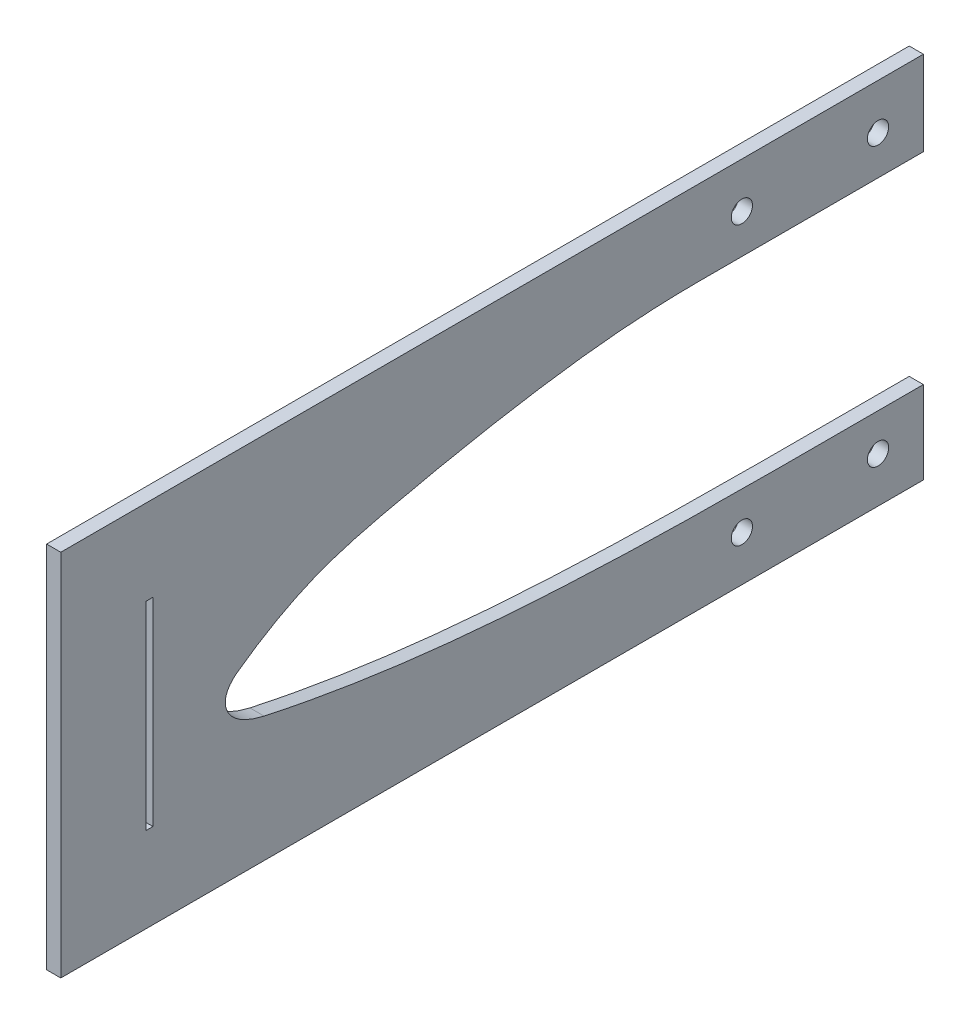
ISO-10303-21;
HEADER;
FILE_DESCRIPTION(('STEP AP214'),'2;1');
FILE_NAME('part.step','',(''),(''),'','','');
FILE_SCHEMA(('AUTOMOTIVE_DESIGN { 1 0 10303 214 1 1 1 1 }'));
ENDSEC;
DATA;
#1=APPLICATION_CONTEXT('core data for automotive mechanical design processes');
#2=APPLICATION_PROTOCOL_DEFINITION('international standard','automotive_design',2000,#1);
#3=PRODUCT_CONTEXT('',#1,'mechanical');
#4=PRODUCT('Part','Part','',(#3));
#5=PRODUCT_RELATED_PRODUCT_CATEGORY('part','',(#4));
#6=PRODUCT_DEFINITION_FORMATION('','',#4);
#7=PRODUCT_DEFINITION_CONTEXT('part definition',#1,'design');
#8=PRODUCT_DEFINITION('design','',#6,#7);
#9=PRODUCT_DEFINITION_SHAPE('','',#8);
#10=(LENGTH_UNIT() NAMED_UNIT(*) SI_UNIT(.MILLI.,.METRE.));
#11=(NAMED_UNIT(*) PLANE_ANGLE_UNIT() SI_UNIT($,.RADIAN.));
#12=(NAMED_UNIT(*) SI_UNIT($,.STERADIAN.) SOLID_ANGLE_UNIT());
#13=UNCERTAINTY_MEASURE_WITH_UNIT(LENGTH_MEASURE(1.E-05),#10,'distance_accuracy_value','');
#14=(GEOMETRIC_REPRESENTATION_CONTEXT(3) GLOBAL_UNCERTAINTY_ASSIGNED_CONTEXT((#13)) GLOBAL_UNIT_ASSIGNED_CONTEXT((#10,
#11,#12)) REPRESENTATION_CONTEXT('',''));
#15=CARTESIAN_POINT('',(0.,0.,0.));
#16=DIRECTION('',(0.,0.,1.));
#17=DIRECTION('',(1.,0.,0.));
#18=AXIS2_PLACEMENT_3D('',#15,#16,#17);
#19=CARTESIAN_POINT('',(-3.17500000000001,63.5,-133.41515968985));
#20=DIRECTION('',(0.,0.,-1.));
#21=DIRECTION('',(-1.,0.,0.));
#22=AXIS2_PLACEMENT_3D('',#19,#20,#21);
#23=PLANE('',#22);
#24=DIRECTION('',(0.,1.,0.));
#25=VECTOR('',#24,1.);
#26=CARTESIAN_POINT('',(0.,63.5,-133.41515968985));
#27=LINE('',#26,#25);
#28=CARTESIAN_POINT('',(0.,44.5871146134634,-133.41515968985));
#29=VERTEX_POINT('',#28);
#30=CARTESIAN_POINT('',(0.,63.5,-133.41515968985));
#31=VERTEX_POINT('',#30);
#32=EDGE_CURVE('E164',#29,#31,#27,.T.);
#33=ORIENTED_EDGE('',*,*,#32,.F.);
#34=DIRECTION('',(1.,0.,0.));
#35=VECTOR('',#34,1.);
#36=CARTESIAN_POINT('',(-3.17500000000001,44.5871146134634,-133.41515968985));
#37=LINE('',#36,#35);
#38=CARTESIAN_POINT('',(-3.17500000000001,44.5871146134634,-133.41515968985));
#39=VERTEX_POINT('',#38);
#40=EDGE_CURVE('E11',#39,#29,#37,.T.);
#41=ORIENTED_EDGE('',*,*,#40,.F.);
#42=DIRECTION('',(0.,1.,0.));
#43=VECTOR('',#42,1.);
#44=CARTESIAN_POINT('',(-3.17500000000001,63.5,-133.41515968985));
#45=LINE('',#44,#43);
#46=CARTESIAN_POINT('',(-3.17500000000001,63.5,-133.41515968985));
#47=VERTEX_POINT('',#46);
#48=EDGE_CURVE('E168',#39,#47,#45,.T.);
#49=ORIENTED_EDGE('',*,*,#48,.T.);
#50=DIRECTION('',(1.,0.,0.));
#51=VECTOR('',#50,1.);
#52=CARTESIAN_POINT('',(-3.17500000000001,63.5,-133.41515968985));
#53=LINE('',#52,#51);
#54=EDGE_CURVE('E35',#47,#31,#53,.T.);
#55=ORIENTED_EDGE('',*,*,#54,.T.);
#56=EDGE_LOOP('',(#33,#41,#49,#55));
#57=FACE_BOUND('',#56,.T.);
#58=ADVANCED_FACE('F32',(#57),#23,.T.);
#59=CARTESIAN_POINT('',(-3.17500000000001,44.5871146134634,-82.6151596898558));
#60=DIRECTION('',(0.,-1.,0.));
#61=DIRECTION('',(0.,0.,-1.));
#62=AXIS2_PLACEMENT_3D('',#59,#60,#61);
#63=PLANE('',#62);
#64=DIRECTION('',(0.,0.,-1.));
#65=VECTOR('',#64,1.);
#66=CARTESIAN_POINT('',(0.,44.5871146134634,-82.6151596898558));
#67=LINE('',#66,#65);
#68=CARTESIAN_POINT('',(0.,44.5871146134634,-82.6151596898558));
#69=VERTEX_POINT('',#68);
#70=EDGE_CURVE('E172',#69,#29,#67,.T.);
#71=ORIENTED_EDGE('',*,*,#70,.F.);
#72=DIRECTION('',(1.,0.,0.));
#73=VECTOR('',#72,1.);
#74=CARTESIAN_POINT('',(-3.17500000000001,44.5871146134634,-82.6151596898558));
#75=LINE('',#74,#73);
#76=CARTESIAN_POINT('',(-3.17500000000001,44.5871146134634,-82.6151596898558));
#77=VERTEX_POINT('',#76);
#78=EDGE_CURVE('E40',#77,#69,#75,.T.);
#79=ORIENTED_EDGE('',*,*,#78,.F.);
#80=DIRECTION('',(0.,0.,-1.));
#81=VECTOR('',#80,1.);
#82=CARTESIAN_POINT('',(-3.17500000000001,44.5871146134634,-82.6151596898558));
#83=LINE('',#82,#81);
#84=EDGE_CURVE('E268',#77,#39,#83,.T.);
#85=ORIENTED_EDGE('',*,*,#84,.T.);
#86=ORIENTED_EDGE('',*,*,#40,.T.);
#87=EDGE_LOOP('',(#71,#79,#85,#86));
#88=FACE_BOUND('',#87,.T.);
#89=ADVANCED_FACE('F228',(#88),#63,.T.);
#90=CARTESIAN_POINT('',(-3.17500000000001,20.4362945173042,20.193079640347));
#91=CARTESIAN_POINT('',(-3.17500000000001,21.7725884271438,18.3776316516558));
#92=CARTESIAN_POINT('',(-3.17500000000001,24.2939246272368,14.6309318441548));
#93=CARTESIAN_POINT('',(-3.17500000000001,27.6399469513576,8.75815850367955));
#94=CARTESIAN_POINT('',(-3.17500000000001,30.461192503559,2.61298240056165));
#95=CARTESIAN_POINT('',(-3.17500000000001,32.6258682558907,-3.77611271705029));
#96=CARTESIAN_POINT('',(-3.17500000000001,34.3162947317147,-10.2720268566466));
#97=CARTESIAN_POINT('',(-3.17500000000001,36.2894369968429,-18.9380734883094));
#98=CARTESIAN_POINT('',(-3.17500000000001,38.5876517653964,-29.7671938587769));
#99=CARTESIAN_POINT('',(-3.17500000000001,40.9836033041113,-42.8466446808765));
#100=CARTESIAN_POINT('',(-3.17500000000001,42.9550553417192,-56.0466133878559));
#101=CARTESIAN_POINT('',(-3.17500000000001,44.265541415919,-69.3230220526745));
#102=CARTESIAN_POINT('',(-3.17500000000001,44.5595908468446,-78.1825176153435));
#103=CARTESIAN_POINT('',(-3.17500000000001,44.5871146134634,-82.6151596898558));
#104=B_SPLINE_CURVE_WITH_KNOTS('',3,(#90,#91,#92,#93,#94,#95,#96,#97,#98,#99,#100,#101,#102,
#103),.UNSPECIFIED.,.F.,.F.,(4,1,1,1,1,1,1,1,1,1,1,4),(0.0239196569673538,0.0405843810237883,
0.0572491050802228,0.0739138291366573,0.0905785531930918,0.107243277249526,0.123908001305961,
0.15723744941883,0.190566897531699,0.223896345644568,0.257225793757437,0.290555241870306),.UNSPECIFIED.);
#105=DIRECTION('',(1.,0.,0.));
#106=VECTOR('',#105,1.);
#107=SURFACE_OF_LINEAR_EXTRUSION('',#104,#106);
#108=CARTESIAN_POINT('',(0.,20.4362945173042,20.193079640347));
#109=CARTESIAN_POINT('',(0.,21.7725884271438,18.3776316516558));
#110=CARTESIAN_POINT('',(0.,24.2939246272368,14.6309318441548));
#111=CARTESIAN_POINT('',(0.,27.6399469513576,8.75815850367955));
#112=CARTESIAN_POINT('',(0.,30.461192503559,2.61298240056165));
#113=CARTESIAN_POINT('',(0.,32.6258682558907,-3.77611271705029));
#114=CARTESIAN_POINT('',(0.,34.3162947317147,-10.2720268566466));
#115=CARTESIAN_POINT('',(0.,36.2894369968429,-18.9380734883094));
#116=CARTESIAN_POINT('',(0.,38.5876517653964,-29.7671938587769));
#117=CARTESIAN_POINT('',(0.,40.9836033041113,-42.8466446808765));
#118=CARTESIAN_POINT('',(0.,42.9550553417192,-56.0466133878559));
#119=CARTESIAN_POINT('',(0.,44.265541415919,-69.3230220526745));
#120=CARTESIAN_POINT('',(0.,44.5595908468446,-78.1825176153435));
#121=CARTESIAN_POINT('',(0.,44.5871146134634,-82.6151596898558));
#122=B_SPLINE_CURVE_WITH_KNOTS('',3,(#108,#109,#110,#111,#112,#113,#114,#115,#116,#117,#118,
#119,#120,#121),.UNSPECIFIED.,.F.,.F.,(4,1,1,1,1,1,1,1,1,1,1,4),(0.0239196569673538,
0.0405843810237883,0.0572491050802228,0.0739138291366573,0.0905785531930918,0.107243277249526,
0.123908001305961,0.15723744941883,0.190566897531699,0.223896345644568,0.257225793757437,
0.290555241870306),.UNSPECIFIED.);
#123=CARTESIAN_POINT('',(0.,20.4362945173064,20.193079640344));
#124=VERTEX_POINT('',#123);
#125=EDGE_CURVE('E248',#124,#69,#122,.T.);
#126=ORIENTED_EDGE('',*,*,#125,.F.);
#127=DIRECTION('',(1.,0.,0.));
#128=VECTOR('',#127,1.);
#129=CARTESIAN_POINT('',(-3.17500000000001,20.4362945173064,20.193079640344));
#130=LINE('',#129,#128);
#131=CARTESIAN_POINT('',(-3.17500000000001,20.4362945173064,20.193079640344));
#132=VERTEX_POINT('',#131);
#133=EDGE_CURVE('E257',#132,#124,#130,.T.);
#134=ORIENTED_EDGE('',*,*,#133,.F.);
#135=EDGE_CURVE('E270',#132,#77,#104,.T.);
#136=ORIENTED_EDGE('',*,*,#135,.T.);
#137=ORIENTED_EDGE('',*,*,#78,.T.);
#138=EDGE_LOOP('',(#126,#134,#136,#137));
#139=FACE_BOUND('',#138,.T.);
#140=ADVANCED_FACE('F233',(#139),#107,.T.);
#141=CARTESIAN_POINT('',(-3.17500000000001,8.97782936239336,14.1982231822655));
#142=CARTESIAN_POINT('',(-3.17500000000001,9.11438883700085,14.8240537362325));
#143=CARTESIAN_POINT('',(-3.17500000000001,9.43691981583924,16.0604654481563));
#144=CARTESIAN_POINT('',(-3.17500000000001,10.1086609381467,17.8898569346086));
#145=CARTESIAN_POINT('',(-3.17500000000001,11.016731837546,19.6512705792655));
#146=CARTESIAN_POINT('',(-3.17500000000001,12.2842915384697,21.322312986186));
#147=CARTESIAN_POINT('',(-3.17500000000001,13.8524018611577,22.4894068560444));
#148=CARTESIAN_POINT('',(-3.17500000000001,15.5147611545624,22.9162870431298));
#149=CARTESIAN_POINT('',(-3.17500000000001,16.8255825352368,22.8416008155577));
#150=CARTESIAN_POINT('',(-3.17500000000001,18.0065510438636,22.4111435921439));
#151=CARTESIAN_POINT('',(-3.17500000000001,18.9792892067153,21.7735345570385));
#152=CARTESIAN_POINT('',(-3.17500000000001,19.787144829148,21.0150805317412));
#153=CARTESIAN_POINT('',(-3.17500000000001,20.227535182733,20.4766936801006));
#154=CARTESIAN_POINT('',(-3.17500000000001,20.4362945173064,20.193079640344));
#155=B_SPLINE_CURVE_WITH_KNOTS('',3,(#141,#142,#143,#144,#145,#146,#147,#148,#149,#150,#151,
#152,#153,#154),.UNSPECIFIED.,.F.,.F.,(4,1,1,1,1,1,1,1,1,1,1,4),(0.,0.125,0.25,0.375,0.5,0.625,
0.6875,0.75,0.8125,0.875,0.9375,1.),.UNSPECIFIED.);
#156=DIRECTION('',(1.,0.,0.));
#157=VECTOR('',#156,1.);
#158=SURFACE_OF_LINEAR_EXTRUSION('',#155,#157);
#159=CARTESIAN_POINT('',(0.,8.97782936239336,14.1982231822655));
#160=CARTESIAN_POINT('',(0.,9.11438883700085,14.8240537362325));
#161=CARTESIAN_POINT('',(0.,9.43691981583924,16.0604654481563));
#162=CARTESIAN_POINT('',(0.,10.1086609381467,17.8898569346086));
#163=CARTESIAN_POINT('',(0.,11.016731837546,19.6512705792655));
#164=CARTESIAN_POINT('',(0.,12.2842915384697,21.322312986186));
#165=CARTESIAN_POINT('',(0.,13.8524018611577,22.4894068560444));
#166=CARTESIAN_POINT('',(0.,15.5147611545624,22.9162870431298));
#167=CARTESIAN_POINT('',(0.,16.8255825352368,22.8416008155577));
#168=CARTESIAN_POINT('',(0.,18.0065510438636,22.4111435921439));
#169=CARTESIAN_POINT('',(0.,18.9792892067153,21.7735345570385));
#170=CARTESIAN_POINT('',(0.,19.787144829148,21.0150805317412));
#171=CARTESIAN_POINT('',(0.,20.227535182733,20.4766936801006));
#172=CARTESIAN_POINT('',(0.,20.4362945173064,20.193079640344));
#173=B_SPLINE_CURVE_WITH_KNOTS('',3,(#159,#160,#161,#162,#163,#164,#165,#166,#167,#168,#169,
#170,#171,#172),.UNSPECIFIED.,.F.,.F.,(4,1,1,1,1,1,1,1,1,1,1,4),(0.,0.125,0.25,0.375,0.5,0.625,
0.6875,0.75,0.8125,0.875,0.9375,1.),.UNSPECIFIED.);
#174=CARTESIAN_POINT('',(0.,8.97782936239298,14.1982231822637));
#175=VERTEX_POINT('',#174);
#176=EDGE_CURVE('E250',#175,#124,#173,.T.);
#177=ORIENTED_EDGE('',*,*,#176,.F.);
#178=DIRECTION('',(1.,0.,0.));
#179=VECTOR('',#178,1.);
#180=CARTESIAN_POINT('',(-3.17500000000001,8.97782936239298,14.1982231822637));
#181=LINE('',#180,#179);
#182=CARTESIAN_POINT('',(-3.17500000000001,8.97782936239298,14.1982231822637));
#183=VERTEX_POINT('',#182);
#184=EDGE_CURVE('E259',#183,#175,#181,.T.);
#185=ORIENTED_EDGE('',*,*,#184,.F.);
#186=EDGE_CURVE('E190',#183,#132,#155,.T.);
#187=ORIENTED_EDGE('',*,*,#186,.T.);
#188=ORIENTED_EDGE('',*,*,#133,.T.);
#189=EDGE_LOOP('',(#177,#185,#187,#188));
#190=FACE_BOUND('',#189,.T.);
#191=ADVANCED_FACE('F204',(#190),#158,.T.);
#192=CARTESIAN_POINT('',(-3.17500000000001,1.80824383541066,-319.839297350167));
#193=CARTESIAN_POINT('',(-3.17500000000001,1.33935492784135,-305.918926030611));
#194=CARTESIAN_POINT('',(-3.17500000000001,0.589781458302051,-278.071405869785));
#195=CARTESIAN_POINT('',(-3.17500000000001,-0.0848839208893777,-236.292586283682));
#196=CARTESIAN_POINT('',(-3.17500000000001,-0.42398764722637,-194.497528689088));
#197=CARTESIAN_POINT('',(-3.17500000000001,-0.526178248479325,-159.652465698219));
#198=CARTESIAN_POINT('',(-3.17500000000001,-0.549636288623372,-131.764402884072));
#199=CARTESIAN_POINT('',(-3.17500000000001,-0.579152931808272,-103.868546853979));
#200=CARTESIAN_POINT('',(-3.17500000000001,-0.463400228569414,-75.9447694848647));
#201=CARTESIAN_POINT('',(-3.17500000000001,0.71628118688845,-48.0810605073001));
#202=CARTESIAN_POINT('',(-3.17500000000001,2.3477629638623,-27.2352529633963));
#203=CARTESIAN_POINT('',(-3.17500000000001,4.51629367284444,-9.92135003083063));
#204=CARTESIAN_POINT('',(-3.17500000000001,6.84520697551697,3.87536638899543));
#205=CARTESIAN_POINT('',(-3.17500000000001,8.22944774826509,10.7685460614046));
#206=CARTESIAN_POINT('',(-3.17500000000001,8.97782936239298,14.1982231822637));
#207=B_SPLINE_CURVE_WITH_KNOTS('',3,(#192,#193,#194,#195,#196,#197,#198,#199,#200,#201,#202,
#203,#204,#205,#206),.UNSPECIFIED.,.F.,.F.,(4,1,1,1,1,1,1,1,1,1,1,1,4),(0.232141685480897,
0.324521547514971,0.416901409549045,0.509281271583119,0.601661133617194,0.647851064634231,
0.694040995651268,0.786420857685342,0.832610788702379,0.878800719719416,0.924990650736453,
0.948085616244972,0.97118058175349),.UNSPECIFIED.);
#208=DIRECTION('',(1.,0.,0.));
#209=VECTOR('',#208,1.);
#210=SURFACE_OF_LINEAR_EXTRUSION('',#207,#209);
#211=CARTESIAN_POINT('',(0.,1.80824383541066,-319.839297350167));
#212=CARTESIAN_POINT('',(0.,1.33935492784135,-305.918926030611));
#213=CARTESIAN_POINT('',(0.,0.589781458302051,-278.071405869785));
#214=CARTESIAN_POINT('',(0.,-0.0848839208893777,-236.292586283682));
#215=CARTESIAN_POINT('',(0.,-0.42398764722637,-194.497528689088));
#216=CARTESIAN_POINT('',(0.,-0.526178248479325,-159.652465698219));
#217=CARTESIAN_POINT('',(0.,-0.549636288623372,-131.764402884072));
#218=CARTESIAN_POINT('',(0.,-0.579152931808272,-103.868546853979));
#219=CARTESIAN_POINT('',(0.,-0.463400228569414,-75.9447694848647));
#220=CARTESIAN_POINT('',(0.,0.71628118688845,-48.0810605073001));
#221=CARTESIAN_POINT('',(0.,2.3477629638623,-27.2352529633963));
#222=CARTESIAN_POINT('',(0.,4.51629367284444,-9.92135003083063));
#223=CARTESIAN_POINT('',(0.,6.84520697551697,3.87536638899543));
#224=CARTESIAN_POINT('',(0.,8.22944774826509,10.7685460614046));
#225=CARTESIAN_POINT('',(0.,8.97782936239298,14.1982231822637));
#226=B_SPLINE_CURVE_WITH_KNOTS('',3,(#211,#212,#213,#214,#215,#216,#217,#218,#219,#220,#221,
#222,#223,#224,#225),.UNSPECIFIED.,.F.,.F.,(4,1,1,1,1,1,1,1,1,1,1,1,4),(0.232141685480897,
0.324521547514971,0.416901409549045,0.509281271583119,0.601661133617194,0.647851064634231,
0.694040995651268,0.786420857685342,0.832610788702379,0.878800719719416,0.924990650736453,
0.948085616244972,0.97118058175349),.UNSPECIFIED.);
#227=CARTESIAN_POINT('',(0.,-0.548836446226245,-133.415159689849));
#228=VERTEX_POINT('',#227);
#229=EDGE_CURVE('E289',#228,#175,#226,.T.);
#230=ORIENTED_EDGE('',*,*,#229,.F.);
#231=DIRECTION('',(1.,0.,0.));
#232=VECTOR('',#231,1.);
#233=CARTESIAN_POINT('',(-3.17500000000001,-0.548836446226245,-133.415159689849));
#234=LINE('',#233,#232);
#235=CARTESIAN_POINT('',(-3.17500000000001,-0.548836446226245,-133.415159689849));
#236=VERTEX_POINT('',#235);
#237=EDGE_CURVE('E261',#236,#228,#234,.T.);
#238=ORIENTED_EDGE('',*,*,#237,.F.);
#239=EDGE_CURVE('E184',#236,#183,#207,.T.);
#240=ORIENTED_EDGE('',*,*,#239,.T.);
#241=ORIENTED_EDGE('',*,*,#184,.T.);
#242=EDGE_LOOP('',(#230,#238,#240,#241));
#243=FACE_BOUND('',#242,.T.);
#244=ADVANCED_FACE('F199',(#243),#210,.T.);
#245=CARTESIAN_POINT('',(-3.17500000000001,-0.548836446226245,-133.415159689849));
#246=DIRECTION('',(0.,0.,-1.));
#247=DIRECTION('',(0.,1.,0.));
#248=AXIS2_PLACEMENT_3D('',#245,#246,#247);
#249=PLANE('',#248);
#250=DIRECTION('',(0.,1.,0.));
#251=VECTOR('',#250,1.);
#252=CARTESIAN_POINT('',(0.,-0.548836446226245,-133.415159689849));
#253=LINE('',#252,#251);
#254=CARTESIAN_POINT('',(0.,-19.05,-133.41515968985));
#255=VERTEX_POINT('',#254);
#256=EDGE_CURVE('E286',#255,#228,#253,.T.);
#257=ORIENTED_EDGE('',*,*,#256,.F.);
#258=DIRECTION('',(1.,0.,0.));
#259=VECTOR('',#258,1.);
#260=CARTESIAN_POINT('',(-3.17500000000001,-19.05,-133.41515968985));
#261=LINE('',#260,#259);
#262=CARTESIAN_POINT('',(-3.17500000000001,-19.05,-133.41515968985));
#263=VERTEX_POINT('',#262);
#264=EDGE_CURVE('E263',#263,#255,#261,.T.);
#265=ORIENTED_EDGE('',*,*,#264,.F.);
#266=DIRECTION('',(0.,1.,0.));
#267=VECTOR('',#266,1.);
#268=CARTESIAN_POINT('',(-3.17500000000001,-0.548836446226245,-133.415159689849));
#269=LINE('',#268,#267);
#270=EDGE_CURVE('E181',#263,#236,#269,.T.);
#271=ORIENTED_EDGE('',*,*,#270,.T.);
#272=ORIENTED_EDGE('',*,*,#237,.T.);
#273=EDGE_LOOP('',(#257,#265,#271,#272));
#274=FACE_BOUND('',#273,.T.);
#275=ADVANCED_FACE('F203',(#274),#249,.T.);
#276=CARTESIAN_POINT('',(-3.17500000000001,-19.05,-133.41515968985));
#277=DIRECTION('',(0.,-1.,0.));
#278=DIRECTION('',(0.,0.,-1.));
#279=AXIS2_PLACEMENT_3D('',#276,#277,#278);
#280=PLANE('',#279);
#281=DIRECTION('',(0.,0.,-1.));
#282=VECTOR('',#281,1.);
#283=CARTESIAN_POINT('',(0.,-19.05,-133.41515968985));
#284=LINE('',#283,#282);
#285=CARTESIAN_POINT('',(0.,-19.05,59.7057172170584));
#286=VERTEX_POINT('',#285);
#287=EDGE_CURVE('E283',#286,#255,#284,.T.);
#288=ORIENTED_EDGE('',*,*,#287,.F.);
#289=DIRECTION('',(1.,0.,0.));
#290=VECTOR('',#289,1.);
#291=CARTESIAN_POINT('',(-3.17500000000001,-19.05,59.7057172170584));
#292=LINE('',#291,#290);
#293=CARTESIAN_POINT('',(-3.17500000000001,-19.05,59.7057172170584));
#294=VERTEX_POINT('',#293);
#295=EDGE_CURVE('E265',#294,#286,#292,.T.);
#296=ORIENTED_EDGE('',*,*,#295,.F.);
#297=DIRECTION('',(0.,0.,-1.));
#298=VECTOR('',#297,1.);
#299=CARTESIAN_POINT('',(-3.17500000000001,-19.05,-133.41515968985));
#300=LINE('',#299,#298);
#301=EDGE_CURVE('E178',#294,#263,#300,.T.);
#302=ORIENTED_EDGE('',*,*,#301,.T.);
#303=ORIENTED_EDGE('',*,*,#264,.T.);
#304=EDGE_LOOP('',(#288,#296,#302,#303));
#305=FACE_BOUND('',#304,.T.);
#306=ADVANCED_FACE('F209',(#305),#280,.T.);
#307=CARTESIAN_POINT('',(-3.17500000000001,63.5,59.7057172170584));
#308=DIRECTION('',(0.,0.,1.));
#309=DIRECTION('',(1.,0.,0.));
#310=AXIS2_PLACEMENT_3D('',#307,#308,#309);
#311=PLANE('',#310);
#312=DIRECTION('',(0.,-1.,0.));
#313=VECTOR('',#312,1.);
#314=CARTESIAN_POINT('',(0.,63.5,59.7057172170584));
#315=LINE('',#314,#313);
#316=CARTESIAN_POINT('',(0.,63.5,59.7057172170584));
#317=VERTEX_POINT('',#316);
#318=EDGE_CURVE('E280',#317,#286,#315,.T.);
#319=ORIENTED_EDGE('',*,*,#318,.F.);
#320=DIRECTION('',(1.,0.,0.));
#321=VECTOR('',#320,1.);
#322=CARTESIAN_POINT('',(-3.17500000000001,63.5,59.7057172170584));
#323=LINE('',#322,#321);
#324=CARTESIAN_POINT('',(-3.17500000000001,63.5,59.7057172170584));
#325=VERTEX_POINT('',#324);
#326=EDGE_CURVE('E266',#325,#317,#323,.T.);
#327=ORIENTED_EDGE('',*,*,#326,.F.);
#328=DIRECTION('',(0.,-1.,0.));
#329=VECTOR('',#328,1.);
#330=CARTESIAN_POINT('',(-3.17500000000001,63.5,59.7057172170584));
#331=LINE('',#330,#329);
#332=EDGE_CURVE('E175',#325,#294,#331,.T.);
#333=ORIENTED_EDGE('',*,*,#332,.T.);
#334=ORIENTED_EDGE('',*,*,#295,.T.);
#335=EDGE_LOOP('',(#319,#327,#333,#334));
#336=FACE_BOUND('',#335,.T.);
#337=ADVANCED_FACE('F213',(#336),#311,.T.);
#338=CARTESIAN_POINT('',(-3.17500000000001,63.5,-133.41515968985));
#339=DIRECTION('',(0.,1.,0.));
#340=DIRECTION('',(0.,0.,1.));
#341=AXIS2_PLACEMENT_3D('',#338,#339,#340);
#342=PLANE('',#341);
#343=DIRECTION('',(0.,0.,1.));
#344=VECTOR('',#343,1.);
#345=CARTESIAN_POINT('',(0.,63.5,-133.41515968985));
#346=LINE('',#345,#344);
#347=EDGE_CURVE('E242',#31,#317,#346,.T.);
#348=ORIENTED_EDGE('',*,*,#347,.F.);
#349=ORIENTED_EDGE('',*,*,#54,.F.);
#350=DIRECTION('',(0.,0.,1.));
#351=VECTOR('',#350,1.);
#352=CARTESIAN_POINT('',(-3.17500000000001,63.5,-133.41515968985));
#353=LINE('',#352,#351);
#354=EDGE_CURVE('E171',#47,#325,#353,.T.);
#355=ORIENTED_EDGE('',*,*,#354,.T.);
#356=ORIENTED_EDGE('',*,*,#326,.T.);
#357=EDGE_LOOP('',(#348,#349,#355,#356));
#358=FACE_BOUND('',#357,.T.);
#359=ADVANCED_FACE('F216',(#358),#342,.T.);
#360=CARTESIAN_POINT('',(-3.17500000000001,38.5273340681382,-29.7812782550333));
#361=DIRECTION('',(1.,0.,0.));
#362=DIRECTION('',(0.,0.,-1.));
#363=AXIS2_PLACEMENT_3D('',#360,#361,#362);
#364=PLANE('',#363);
#365=CARTESIAN_POINT('',(-3.17500000000001,-8.89,-92.7751596898495));
#366=DIRECTION('',(1.,0.,0.));
#367=DIRECTION('',(0.,0.,-1.));
#368=AXIS2_PLACEMENT_3D('',#365,#366,#367);
#369=CIRCLE('',#368,2.38125000000001);
#370=CARTESIAN_POINT('',(-3.17500000000001,-8.89,-95.1564096898495));
#371=VERTEX_POINT('',#370);
#372=EDGE_CURVE('E354',#371,#371,#369,.T.);
#373=ORIENTED_EDGE('',*,*,#372,.T.);
#374=EDGE_LOOP('',(#373));
#375=FACE_BOUND('',#374,.T.);
#376=CARTESIAN_POINT('',(-3.17500000000001,-8.89,-123.25515968985));
#377=DIRECTION('',(1.,0.,0.));
#378=DIRECTION('',(0.,0.,-1.));
#379=AXIS2_PLACEMENT_3D('',#376,#377,#378);
#380=CIRCLE('',#379,2.38124999999999);
#381=CARTESIAN_POINT('',(-3.17500000000001,-8.89,-125.63640968985));
#382=VERTEX_POINT('',#381);
#383=EDGE_CURVE('E362',#382,#382,#380,.T.);
#384=ORIENTED_EDGE('',*,*,#383,.T.);
#385=EDGE_LOOP('',(#384));
#386=FACE_BOUND('',#385,.T.);
#387=CARTESIAN_POINT('',(-3.17500000000001,53.34,-123.25515968985));
#388=DIRECTION('',(1.,0.,0.));
#389=DIRECTION('',(0.,0.,-1.));
#390=AXIS2_PLACEMENT_3D('',#387,#388,#389);
#391=CIRCLE('',#390,2.38124999999999);
#392=CARTESIAN_POINT('',(-3.17500000000001,53.34,-125.63640968985));
#393=VERTEX_POINT('',#392);
#394=EDGE_CURVE('E368',#393,#393,#391,.T.);
#395=ORIENTED_EDGE('',*,*,#394,.T.);
#396=EDGE_LOOP('',(#395));
#397=FACE_BOUND('',#396,.T.);
#398=CARTESIAN_POINT('',(-3.17500000000001,53.34,-92.7751596898495));
#399=DIRECTION('',(1.,0.,0.));
#400=DIRECTION('',(0.,0.,-1.));
#401=AXIS2_PLACEMENT_3D('',#398,#399,#400);
#402=CIRCLE('',#401,2.38125);
#403=CARTESIAN_POINT('',(-3.17500000000001,53.34,-95.1564096898495));
#404=VERTEX_POINT('',#403);
#405=EDGE_CURVE('E158',#404,#404,#402,.T.);
#406=ORIENTED_EDGE('',*,*,#405,.T.);
#407=EDGE_LOOP('',(#406));
#408=FACE_BOUND('',#407,.T.);
#409=DIRECTION('',(0.,0.,-1.));
#410=VECTOR('',#409,1.);
#411=CARTESIAN_POINT('',(-3.17500000000001,0.,39.0682172170584));
#412=LINE('',#411,#410);
#413=CARTESIAN_POINT('',(-3.17500000000001,0.,40.6557172170584));
#414=VERTEX_POINT('',#413);
#415=CARTESIAN_POINT('',(-3.17500000000001,0.,39.0682172170584));
#416=VERTEX_POINT('',#415);
#417=EDGE_CURVE('E135',#414,#416,#412,.T.);
#418=ORIENTED_EDGE('',*,*,#417,.T.);
#419=DIRECTION('',(0.,1.,0.));
#420=VECTOR('',#419,1.);
#421=CARTESIAN_POINT('',(-3.17500000000001,44.45,39.0682172170584));
#422=LINE('',#421,#420);
#423=CARTESIAN_POINT('',(-3.17500000000001,44.45,39.0682172170584));
#424=VERTEX_POINT('',#423);
#425=EDGE_CURVE('E129',#416,#424,#422,.T.);
#426=ORIENTED_EDGE('',*,*,#425,.T.);
#427=DIRECTION('',(0.,0.,1.));
#428=VECTOR('',#427,1.);
#429=CARTESIAN_POINT('',(-3.17500000000001,44.45,39.0682172170584));
#430=LINE('',#429,#428);
#431=CARTESIAN_POINT('',(-3.17500000000001,44.45,40.6557172170584));
#432=VERTEX_POINT('',#431);
#433=EDGE_CURVE('E138',#424,#432,#430,.T.);
#434=ORIENTED_EDGE('',*,*,#433,.T.);
#435=DIRECTION('',(0.,-1.,0.));
#436=VECTOR('',#435,1.);
#437=CARTESIAN_POINT('',(-3.17500000000001,44.45,40.6557172170584));
#438=LINE('',#437,#436);
#439=EDGE_CURVE('E48',#432,#414,#438,.T.);
#440=ORIENTED_EDGE('',*,*,#439,.T.);
#441=EDGE_LOOP('',(#418,#426,#434,#440));
#442=FACE_BOUND('',#441,.T.);
#443=ORIENTED_EDGE('',*,*,#48,.F.);
#444=ORIENTED_EDGE('',*,*,#84,.F.);
#445=ORIENTED_EDGE('',*,*,#135,.F.);
#446=ORIENTED_EDGE('',*,*,#186,.F.);
#447=ORIENTED_EDGE('',*,*,#239,.F.);
#448=ORIENTED_EDGE('',*,*,#270,.F.);
#449=ORIENTED_EDGE('',*,*,#301,.F.);
#450=ORIENTED_EDGE('',*,*,#332,.F.);
#451=ORIENTED_EDGE('',*,*,#354,.F.);
#452=EDGE_LOOP('',(#443,#444,#445,#446,#447,#448,#449,#450,#451));
#453=FACE_BOUND('',#452,.T.);
#454=ADVANCED_FACE('F142',(#375,#386,#397,#408,#442,#453),#364,.F.);
#455=CARTESIAN_POINT('',(0.,38.5273340681382,-29.7812782550333));
#456=DIRECTION('',(1.,0.,0.));
#457=DIRECTION('',(0.,0.,-1.));
#458=AXIS2_PLACEMENT_3D('',#455,#456,#457);
#459=PLANE('',#458);
#460=CARTESIAN_POINT('',(0.,-8.89,-92.7751596898495));
#461=DIRECTION('',(1.,0.,0.));
#462=DIRECTION('',(0.,0.,-1.));
#463=AXIS2_PLACEMENT_3D('',#460,#461,#462);
#464=CIRCLE('',#463,2.38125000000001);
#465=CARTESIAN_POINT('',(0.,-8.89,-95.1564096898495));
#466=VERTEX_POINT('',#465);
#467=EDGE_CURVE('E357',#466,#466,#464,.T.);
#468=ORIENTED_EDGE('',*,*,#467,.F.);
#469=EDGE_LOOP('',(#468));
#470=FACE_BOUND('',#469,.T.);
#471=CARTESIAN_POINT('',(0.,-8.89,-123.25515968985));
#472=DIRECTION('',(1.,0.,0.));
#473=DIRECTION('',(0.,0.,-1.));
#474=AXIS2_PLACEMENT_3D('',#471,#472,#473);
#475=CIRCLE('',#474,2.38124999999999);
#476=CARTESIAN_POINT('',(0.,-8.89,-125.63640968985));
#477=VERTEX_POINT('',#476);
#478=EDGE_CURVE('E359',#477,#477,#475,.T.);
#479=ORIENTED_EDGE('',*,*,#478,.F.);
#480=EDGE_LOOP('',(#479));
#481=FACE_BOUND('',#480,.T.);
#482=CARTESIAN_POINT('',(0.,53.34,-123.25515968985));
#483=DIRECTION('',(1.,0.,0.));
#484=DIRECTION('',(0.,0.,-1.));
#485=AXIS2_PLACEMENT_3D('',#482,#483,#484);
#486=CIRCLE('',#485,2.38124999999999);
#487=CARTESIAN_POINT('',(0.,53.34,-125.63640968985));
#488=VERTEX_POINT('',#487);
#489=EDGE_CURVE('E365',#488,#488,#486,.T.);
#490=ORIENTED_EDGE('',*,*,#489,.F.);
#491=EDGE_LOOP('',(#490));
#492=FACE_BOUND('',#491,.T.);
#493=CARTESIAN_POINT('',(0.,53.34,-92.7751596898495));
#494=DIRECTION('',(1.,0.,0.));
#495=DIRECTION('',(0.,0.,-1.));
#496=AXIS2_PLACEMENT_3D('',#493,#494,#495);
#497=CIRCLE('',#496,2.38125);
#498=CARTESIAN_POINT('',(0.,53.34,-95.1564096898495));
#499=VERTEX_POINT('',#498);
#500=EDGE_CURVE('E151',#499,#499,#497,.T.);
#501=ORIENTED_EDGE('',*,*,#500,.F.);
#502=EDGE_LOOP('',(#501));
#503=FACE_BOUND('',#502,.T.);
#504=DIRECTION('',(0.,1.,0.));
#505=VECTOR('',#504,1.);
#506=CARTESIAN_POINT('',(0.,44.45,39.0682172170584));
#507=LINE('',#506,#505);
#508=CARTESIAN_POINT('',(0.,0.,39.0682172170584));
#509=VERTEX_POINT('',#508);
#510=CARTESIAN_POINT('',(0.,44.45,39.0682172170584));
#511=VERTEX_POINT('',#510);
#512=EDGE_CURVE('E56',#509,#511,#507,.T.);
#513=ORIENTED_EDGE('',*,*,#512,.F.);
#514=DIRECTION('',(0.,0.,-1.));
#515=VECTOR('',#514,1.);
#516=CARTESIAN_POINT('',(0.,0.,39.0682172170584));
#517=LINE('',#516,#515);
#518=CARTESIAN_POINT('',(0.,0.,40.6557172170584));
#519=VERTEX_POINT('',#518);
#520=EDGE_CURVE('E145',#519,#509,#517,.T.);
#521=ORIENTED_EDGE('',*,*,#520,.F.);
#522=DIRECTION('',(0.,-1.,0.));
#523=VECTOR('',#522,1.);
#524=CARTESIAN_POINT('',(0.,44.45,40.6557172170584));
#525=LINE('',#524,#523);
#526=CARTESIAN_POINT('',(0.,44.45,40.6557172170584));
#527=VERTEX_POINT('',#526);
#528=EDGE_CURVE('E148',#527,#519,#525,.T.);
#529=ORIENTED_EDGE('',*,*,#528,.F.);
#530=DIRECTION('',(0.,0.,1.));
#531=VECTOR('',#530,1.);
#532=CARTESIAN_POINT('',(0.,44.45,39.0682172170584));
#533=LINE('',#532,#531);
#534=EDGE_CURVE('E157',#511,#527,#533,.T.);
#535=ORIENTED_EDGE('',*,*,#534,.F.);
#536=EDGE_LOOP('',(#513,#521,#529,#535));
#537=FACE_BOUND('',#536,.T.);
#538=ORIENTED_EDGE('',*,*,#32,.T.);
#539=ORIENTED_EDGE('',*,*,#347,.T.);
#540=ORIENTED_EDGE('',*,*,#318,.T.);
#541=ORIENTED_EDGE('',*,*,#287,.T.);
#542=ORIENTED_EDGE('',*,*,#256,.T.);
#543=ORIENTED_EDGE('',*,*,#229,.T.);
#544=ORIENTED_EDGE('',*,*,#176,.T.);
#545=ORIENTED_EDGE('',*,*,#125,.T.);
#546=ORIENTED_EDGE('',*,*,#70,.T.);
#547=EDGE_LOOP('',(#538,#539,#540,#541,#542,#543,#544,#545,#546));
#548=FACE_BOUND('',#547,.T.);
#549=ADVANCED_FACE('F223',(#470,#481,#492,#503,#537,#548),#459,.T.);
#550=CARTESIAN_POINT('',(-3.17500000000001,44.45,39.0682172170584));
#551=DIRECTION('',(0.,0.,-1.));
#552=DIRECTION('',(0.,1.,0.));
#553=AXIS2_PLACEMENT_3D('',#550,#551,#552);
#554=PLANE('',#553);
#555=ORIENTED_EDGE('',*,*,#512,.T.);
#556=DIRECTION('',(1.,0.,0.));
#557=VECTOR('',#556,1.);
#558=CARTESIAN_POINT('',(-3.17500000000001,44.45,39.0682172170584));
#559=LINE('',#558,#557);
#560=EDGE_CURVE('E125',#424,#511,#559,.T.);
#561=ORIENTED_EDGE('',*,*,#560,.F.);
#562=ORIENTED_EDGE('',*,*,#425,.F.);
#563=DIRECTION('',(1.,0.,0.));
#564=VECTOR('',#563,1.);
#565=CARTESIAN_POINT('',(-3.17500000000001,0.,39.0682172170584));
#566=LINE('',#565,#564);
#567=EDGE_CURVE('E162',#416,#509,#566,.T.);
#568=ORIENTED_EDGE('',*,*,#567,.T.);
#569=EDGE_LOOP('',(#555,#561,#562,#568));
#570=FACE_BOUND('',#569,.T.);
#571=ADVANCED_FACE('F127',(#570),#554,.F.);
#572=CARTESIAN_POINT('',(-3.17500000000001,0.,39.0682172170584));
#573=DIRECTION('',(0.,-1.,0.));
#574=DIRECTION('',(0.,0.,-1.));
#575=AXIS2_PLACEMENT_3D('',#572,#573,#574);
#576=PLANE('',#575);
#577=ORIENTED_EDGE('',*,*,#520,.T.);
#578=ORIENTED_EDGE('',*,*,#567,.F.);
#579=ORIENTED_EDGE('',*,*,#417,.F.);
#580=DIRECTION('',(1.,0.,0.));
#581=VECTOR('',#580,1.);
#582=CARTESIAN_POINT('',(-3.17500000000001,0.,40.6557172170584));
#583=LINE('',#582,#581);
#584=EDGE_CURVE('E165',#414,#519,#583,.T.);
#585=ORIENTED_EDGE('',*,*,#584,.T.);
#586=EDGE_LOOP('',(#577,#578,#579,#585));
#587=FACE_BOUND('',#586,.T.);
#588=ADVANCED_FACE('F325',(#587),#576,.F.);
#589=CARTESIAN_POINT('',(-3.17500000000001,44.45,40.6557172170584));
#590=DIRECTION('',(0.,0.,1.));
#591=DIRECTION('',(0.,-1.,0.));
#592=AXIS2_PLACEMENT_3D('',#589,#590,#591);
#593=PLANE('',#592);
#594=ORIENTED_EDGE('',*,*,#528,.T.);
#595=ORIENTED_EDGE('',*,*,#584,.F.);
#596=ORIENTED_EDGE('',*,*,#439,.F.);
#597=DIRECTION('',(1.,0.,0.));
#598=VECTOR('',#597,1.);
#599=CARTESIAN_POINT('',(-3.17500000000001,44.45,40.6557172170584));
#600=LINE('',#599,#598);
#601=EDGE_CURVE('E134',#432,#527,#600,.T.);
#602=ORIENTED_EDGE('',*,*,#601,.T.);
#603=EDGE_LOOP('',(#594,#595,#596,#602));
#604=FACE_BOUND('',#603,.T.);
#605=ADVANCED_FACE('F329',(#604),#593,.F.);
#606=CARTESIAN_POINT('',(-3.17500000000001,44.45,39.0682172170584));
#607=DIRECTION('',(0.,1.,0.));
#608=DIRECTION('',(0.,0.,1.));
#609=AXIS2_PLACEMENT_3D('',#606,#607,#608);
#610=PLANE('',#609);
#611=ORIENTED_EDGE('',*,*,#534,.T.);
#612=ORIENTED_EDGE('',*,*,#601,.F.);
#613=ORIENTED_EDGE('',*,*,#433,.F.);
#614=ORIENTED_EDGE('',*,*,#560,.T.);
#615=EDGE_LOOP('',(#611,#612,#613,#614));
#616=FACE_BOUND('',#615,.T.);
#617=ADVANCED_FACE('F139',(#616),#610,.F.);
#618=CARTESIAN_POINT('',(-3.17500000000001,53.34,-92.7751596898495));
#619=DIRECTION('',(1.,0.,0.));
#620=DIRECTION('',(0.,0.,-1.));
#621=AXIS2_PLACEMENT_3D('',#618,#619,#620);
#622=CYLINDRICAL_SURFACE('',#621,2.38125);
#623=ORIENTED_EDGE('',*,*,#405,.F.);
#624=EDGE_LOOP('',(#623));
#625=FACE_BOUND('',#624,.T.);
#626=ORIENTED_EDGE('',*,*,#500,.T.);
#627=EDGE_LOOP('',(#626));
#628=FACE_BOUND('',#627,.T.);
#629=ADVANCED_FACE('F328',(#625,#628),#622,.F.);
#630=CARTESIAN_POINT('',(-3.17500000000001,53.34,-123.25515968985));
#631=DIRECTION('',(1.,0.,0.));
#632=DIRECTION('',(0.,0.,-1.));
#633=AXIS2_PLACEMENT_3D('',#630,#631,#632);
#634=CYLINDRICAL_SURFACE('',#633,2.38124999999999);
#635=ORIENTED_EDGE('',*,*,#394,.F.);
#636=EDGE_LOOP('',(#635));
#637=FACE_BOUND('',#636,.T.);
#638=ORIENTED_EDGE('',*,*,#489,.T.);
#639=EDGE_LOOP('',(#638));
#640=FACE_BOUND('',#639,.T.);
#641=ADVANCED_FACE('F337',(#637,#640),#634,.F.);
#642=CARTESIAN_POINT('',(-3.17500000000001,-8.89,-123.25515968985));
#643=DIRECTION('',(1.,0.,0.));
#644=DIRECTION('',(0.,0.,-1.));
#645=AXIS2_PLACEMENT_3D('',#642,#643,#644);
#646=CYLINDRICAL_SURFACE('',#645,2.38124999999999);
#647=ORIENTED_EDGE('',*,*,#383,.F.);
#648=EDGE_LOOP('',(#647));
#649=FACE_BOUND('',#648,.T.);
#650=ORIENTED_EDGE('',*,*,#478,.T.);
#651=EDGE_LOOP('',(#650));
#652=FACE_BOUND('',#651,.T.);
#653=ADVANCED_FACE('F341',(#649,#652),#646,.F.);
#654=CARTESIAN_POINT('',(-3.17500000000001,-8.89,-92.7751596898495));
#655=DIRECTION('',(1.,0.,0.));
#656=DIRECTION('',(0.,0.,-1.));
#657=AXIS2_PLACEMENT_3D('',#654,#655,#656);
#658=CYLINDRICAL_SURFACE('',#657,2.38125000000001);
#659=ORIENTED_EDGE('',*,*,#372,.F.);
#660=EDGE_LOOP('',(#659));
#661=FACE_BOUND('',#660,.T.);
#662=ORIENTED_EDGE('',*,*,#467,.T.);
#663=EDGE_LOOP('',(#662));
#664=FACE_BOUND('',#663,.T.);
#665=ADVANCED_FACE('F345',(#661,#664),#658,.F.);
#666=CLOSED_SHELL('',(#58,#89,#140,#191,#244,#275,#306,#337,#359,#454,#549,#571,#588,#605,#617,
#629,#641,#653,#665));
#667=MANIFOLD_SOLID_BREP('B2',#666);
#668=ADVANCED_BREP_SHAPE_REPRESENTATION('',(#18,#667),#14);
#669=SHAPE_DEFINITION_REPRESENTATION(#9,#668);
ENDSEC;
END-ISO-10303-21;
